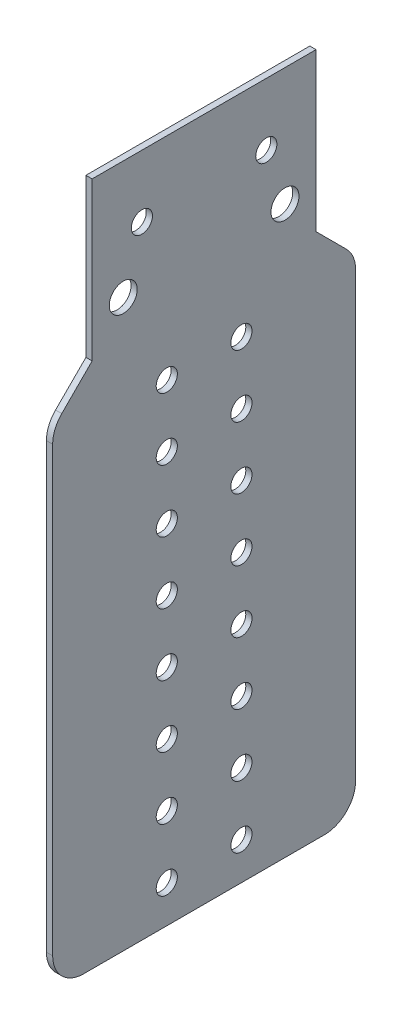
ISO-10303-21;
HEADER;
FILE_DESCRIPTION(('STEP AP214'),'2;1');
FILE_NAME('part.step','',(''),(''),'','','');
FILE_SCHEMA(('AUTOMOTIVE_DESIGN { 1 0 10303 214 1 1 1 1 }'));
ENDSEC;
DATA;
#1=APPLICATION_CONTEXT('core data for automotive mechanical design processes');
#2=APPLICATION_PROTOCOL_DEFINITION('international standard','automotive_design',2000,#1);
#3=PRODUCT_CONTEXT('',#1,'mechanical');
#4=PRODUCT('Part','Part','',(#3));
#5=PRODUCT_RELATED_PRODUCT_CATEGORY('part','',(#4));
#6=PRODUCT_DEFINITION_FORMATION('','',#4);
#7=PRODUCT_DEFINITION_CONTEXT('part definition',#1,'design');
#8=PRODUCT_DEFINITION('design','',#6,#7);
#9=PRODUCT_DEFINITION_SHAPE('','',#8);
#10=(LENGTH_UNIT() NAMED_UNIT(*) SI_UNIT(.MILLI.,.METRE.));
#11=(NAMED_UNIT(*) PLANE_ANGLE_UNIT() SI_UNIT($,.RADIAN.));
#12=(NAMED_UNIT(*) SI_UNIT($,.STERADIAN.) SOLID_ANGLE_UNIT());
#13=UNCERTAINTY_MEASURE_WITH_UNIT(LENGTH_MEASURE(1.E-05),#10,'distance_accuracy_value','');
#14=(GEOMETRIC_REPRESENTATION_CONTEXT(3) GLOBAL_UNCERTAINTY_ASSIGNED_CONTEXT((#13)) GLOBAL_UNIT_ASSIGNED_CONTEXT((#10,
#11,#12)) REPRESENTATION_CONTEXT('',''));
#15=CARTESIAN_POINT('',(0.,0.,0.));
#16=DIRECTION('',(0.,0.,1.));
#17=DIRECTION('',(1.,0.,0.));
#18=AXIS2_PLACEMENT_3D('',#15,#16,#17);
#19=CARTESIAN_POINT('',(1.,0.,-18.));
#20=DIRECTION('',(0.,0.,-1.));
#21=DIRECTION('',(0.,1.,0.));
#22=AXIS2_PLACEMENT_3D('',#19,#20,#21);
#23=PLANE('',#22);
#24=DIRECTION('',(0.,-1.,0.));
#25=VECTOR('',#24,1.);
#26=CARTESIAN_POINT('',(1.,0.,-18.));
#27=LINE('',#26,#25);
#28=CARTESIAN_POINT('',(1.,0.,-18.));
#29=VERTEX_POINT('',#28);
#30=CARTESIAN_POINT('',(1.,-25.35,-18.));
#31=VERTEX_POINT('',#30);
#32=EDGE_CURVE('E389',#29,#31,#27,.T.);
#33=ORIENTED_EDGE('',*,*,#32,.T.);
#34=DIRECTION('',(-1.,0.,0.));
#35=VECTOR('',#34,1.);
#36=CARTESIAN_POINT('',(85.8878377625441,-25.35,-18.));
#37=LINE('',#36,#35);
#38=CARTESIAN_POINT('',(0.,-25.35,-18.));
#39=VERTEX_POINT('',#38);
#40=EDGE_CURVE('E137',#31,#39,#37,.T.);
#41=ORIENTED_EDGE('',*,*,#40,.T.);
#42=DIRECTION('',(0.,-1.,0.));
#43=VECTOR('',#42,1.);
#44=CARTESIAN_POINT('',(0.,0.,-18.));
#45=LINE('',#44,#43);
#46=CARTESIAN_POINT('',(0.,0.,-18.));
#47=VERTEX_POINT('',#46);
#48=EDGE_CURVE('E153',#47,#39,#45,.T.);
#49=ORIENTED_EDGE('',*,*,#48,.F.);
#50=DIRECTION('',(-1.,0.,0.));
#51=VECTOR('',#50,1.);
#52=CARTESIAN_POINT('',(1.,0.,-18.));
#53=LINE('',#52,#51);
#54=EDGE_CURVE('E43',#29,#47,#53,.T.);
#55=ORIENTED_EDGE('',*,*,#54,.F.);
#56=EDGE_LOOP('',(#33,#41,#49,#55));
#57=FACE_BOUND('',#56,.T.);
#58=ADVANCED_FACE('F39',(#57),#23,.T.);
#59=CARTESIAN_POINT('',(1.,0.,18.));
#60=DIRECTION('',(0.,0.,-1.));
#61=DIRECTION('',(0.,1.,0.));
#62=AXIS2_PLACEMENT_3D('',#59,#60,#61);
#63=PLANE('',#62);
#64=DIRECTION('',(-1.,0.,0.));
#65=VECTOR('',#64,1.);
#66=CARTESIAN_POINT('',(85.8878377625441,-25.35,18.));
#67=LINE('',#66,#65);
#68=CARTESIAN_POINT('',(1.,-25.35,18.));
#69=VERTEX_POINT('',#68);
#70=CARTESIAN_POINT('',(0.,-25.35,18.));
#71=VERTEX_POINT('',#70);
#72=EDGE_CURVE('E63',#69,#71,#67,.T.);
#73=ORIENTED_EDGE('',*,*,#72,.F.);
#74=DIRECTION('',(0.,-1.,0.));
#75=VECTOR('',#74,1.);
#76=CARTESIAN_POINT('',(1.,0.,18.));
#77=LINE('',#76,#75);
#78=CARTESIAN_POINT('',(1.,0.,18.));
#79=VERTEX_POINT('',#78);
#80=EDGE_CURVE('E397',#79,#69,#77,.T.);
#81=ORIENTED_EDGE('',*,*,#80,.F.);
#82=DIRECTION('',(-1.,0.,0.));
#83=VECTOR('',#82,1.);
#84=CARTESIAN_POINT('',(1.,0.,18.));
#85=LINE('',#84,#83);
#86=CARTESIAN_POINT('',(0.,0.,18.));
#87=VERTEX_POINT('',#86);
#88=EDGE_CURVE('E11',#79,#87,#85,.T.);
#89=ORIENTED_EDGE('',*,*,#88,.T.);
#90=DIRECTION('',(0.,-1.,0.));
#91=VECTOR('',#90,1.);
#92=CARTESIAN_POINT('',(0.,0.,18.));
#93=LINE('',#92,#91);
#94=EDGE_CURVE('E390',#87,#71,#93,.T.);
#95=ORIENTED_EDGE('',*,*,#94,.T.);
#96=EDGE_LOOP('',(#73,#81,#89,#95));
#97=FACE_BOUND('',#96,.T.);
#98=ADVANCED_FACE('F409',(#97),#63,.F.);
#99=CARTESIAN_POINT('',(1.,0.,18.));
#100=DIRECTION('',(0.,1.,0.));
#101=DIRECTION('',(0.,0.,1.));
#102=AXIS2_PLACEMENT_3D('',#99,#100,#101);
#103=PLANE('',#102);
#104=DIRECTION('',(0.,0.,-1.));
#105=VECTOR('',#104,1.);
#106=CARTESIAN_POINT('',(0.,0.,18.));
#107=LINE('',#106,#105);
#108=EDGE_CURVE('E384',#87,#47,#107,.T.);
#109=ORIENTED_EDGE('',*,*,#108,.F.);
#110=ORIENTED_EDGE('',*,*,#88,.F.);
#111=DIRECTION('',(0.,0.,-1.));
#112=VECTOR('',#111,1.);
#113=CARTESIAN_POINT('',(1.,0.,18.));
#114=LINE('',#113,#112);
#115=EDGE_CURVE('E385',#79,#29,#114,.T.);
#116=ORIENTED_EDGE('',*,*,#115,.T.);
#117=ORIENTED_EDGE('',*,*,#54,.T.);
#118=EDGE_LOOP('',(#109,#110,#116,#117));
#119=FACE_BOUND('',#118,.T.);
#120=ADVANCED_FACE('F41',(#119),#103,.T.);
#121=CARTESIAN_POINT('',(1.,-110.,18.));
#122=DIRECTION('',(0.,1.,0.));
#123=DIRECTION('',(0.,0.,1.));
#124=AXIS2_PLACEMENT_3D('',#121,#122,#123);
#125=PLANE('',#124);
#126=DIRECTION('',(0.,0.,-1.));
#127=VECTOR('',#126,1.);
#128=CARTESIAN_POINT('',(0.,-110.,18.));
#129=LINE('',#128,#127);
#130=CARTESIAN_POINT('',(0.,-110.,19.35));
#131=VERTEX_POINT('',#130);
#132=CARTESIAN_POINT('',(0.,-110.,-19.35));
#133=VERTEX_POINT('',#132);
#134=EDGE_CURVE('E404',#131,#133,#129,.T.);
#135=ORIENTED_EDGE('',*,*,#134,.T.);
#136=DIRECTION('',(-1.,0.,0.));
#137=VECTOR('',#136,1.);
#138=CARTESIAN_POINT('',(85.8878377625441,-110.,-19.35));
#139=LINE('',#138,#137);
#140=CARTESIAN_POINT('',(1.,-110.,-19.35));
#141=VERTEX_POINT('',#140);
#142=EDGE_CURVE('E166',#141,#133,#139,.T.);
#143=ORIENTED_EDGE('',*,*,#142,.F.);
#144=DIRECTION('',(0.,0.,-1.));
#145=VECTOR('',#144,1.);
#146=CARTESIAN_POINT('',(1.,-110.,18.));
#147=LINE('',#146,#145);
#148=CARTESIAN_POINT('',(1.,-110.,19.35));
#149=VERTEX_POINT('',#148);
#150=EDGE_CURVE('E394',#149,#141,#147,.T.);
#151=ORIENTED_EDGE('',*,*,#150,.F.);
#152=DIRECTION('',(-1.,0.,0.));
#153=VECTOR('',#152,1.);
#154=CARTESIAN_POINT('',(85.8878377625441,-110.,19.35));
#155=LINE('',#154,#153);
#156=EDGE_CURVE('E210',#149,#131,#155,.T.);
#157=ORIENTED_EDGE('',*,*,#156,.T.);
#158=EDGE_LOOP('',(#135,#143,#151,#157));
#159=FACE_BOUND('',#158,.T.);
#160=ADVANCED_FACE('F444',(#159),#125,.F.);
#161=CARTESIAN_POINT('',(1.,0.,0.));
#162=DIRECTION('',(-1.,0.,0.));
#163=DIRECTION('',(0.,0.,1.));
#164=AXIS2_PLACEMENT_3D('',#161,#162,#163);
#165=PLANE('',#164);
#166=CARTESIAN_POINT('',(1.,-104.,-6.00000000000038));
#167=DIRECTION('',(1.,0.,0.));
#168=DIRECTION('',(0.,0.,-1.));
#169=AXIS2_PLACEMENT_3D('',#166,#167,#168);
#170=CIRCLE('',#169,1.69999999999999);
#171=CARTESIAN_POINT('',(1.,-104.,-7.70000000000037));
#172=VERTEX_POINT('',#171);
#173=EDGE_CURVE('E194',#172,#172,#170,.T.);
#174=ORIENTED_EDGE('',*,*,#173,.F.);
#175=EDGE_LOOP('',(#174));
#176=FACE_BOUND('',#175,.T.);
#177=CARTESIAN_POINT('',(1.,-104.,5.99999999999962));
#178=DIRECTION('',(1.,0.,0.));
#179=DIRECTION('',(0.,0.,-1.));
#180=AXIS2_PLACEMENT_3D('',#177,#178,#179);
#181=CIRCLE('',#180,1.69999999999999);
#182=CARTESIAN_POINT('',(1.,-104.,4.29999999999963));
#183=VERTEX_POINT('',#182);
#184=EDGE_CURVE('E232',#183,#183,#181,.T.);
#185=ORIENTED_EDGE('',*,*,#184,.F.);
#186=EDGE_LOOP('',(#185));
#187=FACE_BOUND('',#186,.T.);
#188=CARTESIAN_POINT('',(1.,-94.,-6.00000000000034));
#189=DIRECTION('',(1.,0.,0.));
#190=DIRECTION('',(0.,0.,-1.));
#191=AXIS2_PLACEMENT_3D('',#188,#189,#190);
#192=CIRCLE('',#191,1.69999999999999);
#193=CARTESIAN_POINT('',(1.,-94.,-7.70000000000033));
#194=VERTEX_POINT('',#193);
#195=EDGE_CURVE('E240',#194,#194,#192,.T.);
#196=ORIENTED_EDGE('',*,*,#195,.F.);
#197=EDGE_LOOP('',(#196));
#198=FACE_BOUND('',#197,.T.);
#199=CARTESIAN_POINT('',(1.,-94.,5.99999999999966));
#200=DIRECTION('',(1.,0.,0.));
#201=DIRECTION('',(0.,0.,-1.));
#202=AXIS2_PLACEMENT_3D('',#199,#200,#201);
#203=CIRCLE('',#202,1.69999999999999);
#204=CARTESIAN_POINT('',(1.,-94.,4.29999999999967));
#205=VERTEX_POINT('',#204);
#206=EDGE_CURVE('E248',#205,#205,#203,.T.);
#207=ORIENTED_EDGE('',*,*,#206,.F.);
#208=EDGE_LOOP('',(#207));
#209=FACE_BOUND('',#208,.T.);
#210=CARTESIAN_POINT('',(1.,-84.,-6.00000000000031));
#211=DIRECTION('',(1.,0.,0.));
#212=DIRECTION('',(0.,0.,-1.));
#213=AXIS2_PLACEMENT_3D('',#210,#211,#212);
#214=CIRCLE('',#213,1.69999999999999);
#215=CARTESIAN_POINT('',(1.,-84.,-7.7000000000003));
#216=VERTEX_POINT('',#215);
#217=EDGE_CURVE('E256',#216,#216,#214,.T.);
#218=ORIENTED_EDGE('',*,*,#217,.F.);
#219=EDGE_LOOP('',(#218));
#220=FACE_BOUND('',#219,.T.);
#221=CARTESIAN_POINT('',(1.,-84.,5.99999999999969));
#222=DIRECTION('',(1.,0.,0.));
#223=DIRECTION('',(0.,0.,-1.));
#224=AXIS2_PLACEMENT_3D('',#221,#222,#223);
#225=CIRCLE('',#224,1.69999999999999);
#226=CARTESIAN_POINT('',(1.,-84.,4.2999999999997));
#227=VERTEX_POINT('',#226);
#228=EDGE_CURVE('E264',#227,#227,#225,.T.);
#229=ORIENTED_EDGE('',*,*,#228,.F.);
#230=EDGE_LOOP('',(#229));
#231=FACE_BOUND('',#230,.T.);
#232=CARTESIAN_POINT('',(1.,-74.,-6.00000000000027));
#233=DIRECTION('',(1.,0.,0.));
#234=DIRECTION('',(0.,0.,-1.));
#235=AXIS2_PLACEMENT_3D('',#232,#233,#234);
#236=CIRCLE('',#235,1.69999999999999);
#237=CARTESIAN_POINT('',(1.,-74.,-7.70000000000026));
#238=VERTEX_POINT('',#237);
#239=EDGE_CURVE('E272',#238,#238,#236,.T.);
#240=ORIENTED_EDGE('',*,*,#239,.F.);
#241=EDGE_LOOP('',(#240));
#242=FACE_BOUND('',#241,.T.);
#243=CARTESIAN_POINT('',(1.,-74.,5.99999999999973));
#244=DIRECTION('',(1.,0.,0.));
#245=DIRECTION('',(0.,0.,-1.));
#246=AXIS2_PLACEMENT_3D('',#243,#244,#245);
#247=CIRCLE('',#246,1.69999999999999);
#248=CARTESIAN_POINT('',(1.,-74.,4.29999999999974));
#249=VERTEX_POINT('',#248);
#250=EDGE_CURVE('E280',#249,#249,#247,.T.);
#251=ORIENTED_EDGE('',*,*,#250,.F.);
#252=EDGE_LOOP('',(#251));
#253=FACE_BOUND('',#252,.T.);
#254=CARTESIAN_POINT('',(1.,-64.,-6.00000000000024));
#255=DIRECTION('',(1.,0.,0.));
#256=DIRECTION('',(0.,0.,-1.));
#257=AXIS2_PLACEMENT_3D('',#254,#255,#256);
#258=CIRCLE('',#257,1.69999999999999);
#259=CARTESIAN_POINT('',(1.,-64.,-7.70000000000022));
#260=VERTEX_POINT('',#259);
#261=EDGE_CURVE('E288',#260,#260,#258,.T.);
#262=ORIENTED_EDGE('',*,*,#261,.F.);
#263=EDGE_LOOP('',(#262));
#264=FACE_BOUND('',#263,.T.);
#265=CARTESIAN_POINT('',(1.,-64.,5.99999999999976));
#266=DIRECTION('',(1.,0.,0.));
#267=DIRECTION('',(0.,0.,-1.));
#268=AXIS2_PLACEMENT_3D('',#265,#266,#267);
#269=CIRCLE('',#268,1.69999999999999);
#270=CARTESIAN_POINT('',(1.,-64.,4.29999999999978));
#271=VERTEX_POINT('',#270);
#272=EDGE_CURVE('E296',#271,#271,#269,.T.);
#273=ORIENTED_EDGE('',*,*,#272,.F.);
#274=EDGE_LOOP('',(#273));
#275=FACE_BOUND('',#274,.T.);
#276=CARTESIAN_POINT('',(1.,-54.,-6.0000000000002));
#277=DIRECTION('',(1.,0.,0.));
#278=DIRECTION('',(0.,0.,-1.));
#279=AXIS2_PLACEMENT_3D('',#276,#277,#278);
#280=CIRCLE('',#279,1.69999999999999);
#281=CARTESIAN_POINT('',(1.,-54.,-7.70000000000019));
#282=VERTEX_POINT('',#281);
#283=EDGE_CURVE('E304',#282,#282,#280,.T.);
#284=ORIENTED_EDGE('',*,*,#283,.F.);
#285=EDGE_LOOP('',(#284));
#286=FACE_BOUND('',#285,.T.);
#287=CARTESIAN_POINT('',(1.,-54.,5.9999999999998));
#288=DIRECTION('',(1.,0.,0.));
#289=DIRECTION('',(0.,0.,-1.));
#290=AXIS2_PLACEMENT_3D('',#287,#288,#289);
#291=CIRCLE('',#290,1.69999999999999);
#292=CARTESIAN_POINT('',(1.,-54.,4.29999999999981));
#293=VERTEX_POINT('',#292);
#294=EDGE_CURVE('E312',#293,#293,#291,.T.);
#295=ORIENTED_EDGE('',*,*,#294,.F.);
#296=EDGE_LOOP('',(#295));
#297=FACE_BOUND('',#296,.T.);
#298=CARTESIAN_POINT('',(1.,-44.,-6.00000000000017));
#299=DIRECTION('',(1.,0.,0.));
#300=DIRECTION('',(0.,0.,-1.));
#301=AXIS2_PLACEMENT_3D('',#298,#299,#300);
#302=CIRCLE('',#301,1.69999999999999);
#303=CARTESIAN_POINT('',(1.,-44.,-7.70000000000015));
#304=VERTEX_POINT('',#303);
#305=EDGE_CURVE('E320',#304,#304,#302,.T.);
#306=ORIENTED_EDGE('',*,*,#305,.F.);
#307=EDGE_LOOP('',(#306));
#308=FACE_BOUND('',#307,.T.);
#309=CARTESIAN_POINT('',(1.,-44.,5.99999999999983));
#310=DIRECTION('',(1.,0.,0.));
#311=DIRECTION('',(0.,0.,-1.));
#312=AXIS2_PLACEMENT_3D('',#309,#310,#311);
#313=CIRCLE('',#312,1.69999999999999);
#314=CARTESIAN_POINT('',(1.,-44.,4.29999999999985));
#315=VERTEX_POINT('',#314);
#316=EDGE_CURVE('E328',#315,#315,#313,.T.);
#317=ORIENTED_EDGE('',*,*,#316,.F.);
#318=EDGE_LOOP('',(#317));
#319=FACE_BOUND('',#318,.T.);
#320=CARTESIAN_POINT('',(1.,-34.,-6.00000000000013));
#321=DIRECTION('',(1.,0.,0.));
#322=DIRECTION('',(0.,0.,-1.));
#323=AXIS2_PLACEMENT_3D('',#320,#321,#322);
#324=CIRCLE('',#323,1.69999999999999);
#325=CARTESIAN_POINT('',(1.,-34.,-7.70000000000012));
#326=VERTEX_POINT('',#325);
#327=EDGE_CURVE('E336',#326,#326,#324,.T.);
#328=ORIENTED_EDGE('',*,*,#327,.F.);
#329=EDGE_LOOP('',(#328));
#330=FACE_BOUND('',#329,.T.);
#331=CARTESIAN_POINT('',(1.,-34.,5.99999999999987));
#332=DIRECTION('',(1.,0.,0.));
#333=DIRECTION('',(0.,0.,-1.));
#334=AXIS2_PLACEMENT_3D('',#331,#332,#333);
#335=CIRCLE('',#334,1.69999999999999);
#336=CARTESIAN_POINT('',(1.,-34.,4.29999999999988));
#337=VERTEX_POINT('',#336);
#338=EDGE_CURVE('E344',#337,#337,#335,.T.);
#339=ORIENTED_EDGE('',*,*,#338,.F.);
#340=EDGE_LOOP('',(#339));
#341=FACE_BOUND('',#340,.T.);
#342=CARTESIAN_POINT('',(1.,-19.,-13.));
#343=DIRECTION('',(-1.,0.,0.));
#344=DIRECTION('',(0.,0.,1.));
#345=AXIS2_PLACEMENT_3D('',#342,#343,#344);
#346=CIRCLE('',#345,2.25);
#347=CARTESIAN_POINT('',(1.,-19.,-10.75));
#348=VERTEX_POINT('',#347);
#349=EDGE_CURVE('E356',#348,#348,#346,.T.);
#350=ORIENTED_EDGE('',*,*,#349,.T.);
#351=EDGE_LOOP('',(#350));
#352=FACE_BOUND('',#351,.T.);
#353=CARTESIAN_POINT('',(1.,-19.,13.));
#354=DIRECTION('',(-1.,0.,0.));
#355=DIRECTION('',(0.,0.,1.));
#356=AXIS2_PLACEMENT_3D('',#353,#354,#355);
#357=CIRCLE('',#356,2.25);
#358=CARTESIAN_POINT('',(1.,-19.,15.25));
#359=VERTEX_POINT('',#358);
#360=EDGE_CURVE('E364',#359,#359,#357,.T.);
#361=ORIENTED_EDGE('',*,*,#360,.T.);
#362=EDGE_LOOP('',(#361));
#363=FACE_BOUND('',#362,.T.);
#364=CARTESIAN_POINT('',(1.,-10.,-9.99999999999999));
#365=DIRECTION('',(-1.,0.,0.));
#366=DIRECTION('',(0.,0.,1.));
#367=AXIS2_PLACEMENT_3D('',#364,#365,#366);
#368=CIRCLE('',#367,1.7);
#369=CARTESIAN_POINT('',(1.,-10.,-8.3));
#370=VERTEX_POINT('',#369);
#371=EDGE_CURVE('E372',#370,#370,#368,.T.);
#372=ORIENTED_EDGE('',*,*,#371,.T.);
#373=EDGE_LOOP('',(#372));
#374=FACE_BOUND('',#373,.T.);
#375=CARTESIAN_POINT('',(1.,-10.,10.));
#376=DIRECTION('',(-1.,0.,0.));
#377=DIRECTION('',(0.,0.,1.));
#378=AXIS2_PLACEMENT_3D('',#375,#376,#377);
#379=CIRCLE('',#378,1.7);
#380=CARTESIAN_POINT('',(1.,-10.,11.7));
#381=VERTEX_POINT('',#380);
#382=EDGE_CURVE('E380',#381,#381,#379,.T.);
#383=ORIENTED_EDGE('',*,*,#382,.T.);
#384=EDGE_LOOP('',(#383));
#385=FACE_BOUND('',#384,.T.);
#386=ORIENTED_EDGE('',*,*,#115,.F.);
#387=ORIENTED_EDGE('',*,*,#80,.T.);
#388=DIRECTION('',(0.,-0.707106781186551,0.707106781186544));
#389=VECTOR('',#388,1.);
#390=CARTESIAN_POINT('',(1.,-25.35,18.));
#391=LINE('',#390,#389);
#392=CARTESIAN_POINT('',(1.,-30.2355339059328,22.8855339059328));
#393=VERTEX_POINT('',#392);
#394=EDGE_CURVE('E191',#69,#393,#391,.T.);
#395=ORIENTED_EDGE('',*,*,#394,.T.);
#396=CARTESIAN_POINT('',(1.,-33.7710678118655,19.35));
#397=DIRECTION('',(-1.,0.,0.));
#398=DIRECTION('',(0.,0.,1.));
#399=AXIS2_PLACEMENT_3D('',#396,#397,#398);
#400=CIRCLE('',#399,5.);
#401=CARTESIAN_POINT('',(1.,-33.7710678118655,24.35));
#402=VERTEX_POINT('',#401);
#403=EDGE_CURVE('E188',#393,#402,#400,.F.);
#404=ORIENTED_EDGE('',*,*,#403,.T.);
#405=DIRECTION('',(0.,-1.,0.));
#406=VECTOR('',#405,1.);
#407=CARTESIAN_POINT('',(1.,-33.7710678118655,24.35));
#408=LINE('',#407,#406);
#409=CARTESIAN_POINT('',(1.,-105.,24.35));
#410=VERTEX_POINT('',#409);
#411=EDGE_CURVE('E185',#402,#410,#408,.T.);
#412=ORIENTED_EDGE('',*,*,#411,.T.);
#413=CARTESIAN_POINT('',(1.,-105.,19.35));
#414=DIRECTION('',(-1.,0.,0.));
#415=DIRECTION('',(0.,0.,1.));
#416=AXIS2_PLACEMENT_3D('',#413,#414,#415);
#417=CIRCLE('',#416,5.);
#418=EDGE_CURVE('E181',#410,#149,#417,.F.);
#419=ORIENTED_EDGE('',*,*,#418,.T.);
#420=ORIENTED_EDGE('',*,*,#150,.T.);
#421=CARTESIAN_POINT('',(1.,-105.,-19.35));
#422=DIRECTION('',(-1.,0.,0.));
#423=DIRECTION('',(0.,0.,1.));
#424=AXIS2_PLACEMENT_3D('',#421,#422,#423);
#425=CIRCLE('',#424,5.);
#426=CARTESIAN_POINT('',(1.,-105.,-24.35));
#427=VERTEX_POINT('',#426);
#428=EDGE_CURVE('E157',#141,#427,#425,.F.);
#429=ORIENTED_EDGE('',*,*,#428,.T.);
#430=DIRECTION('',(0.,1.,0.));
#431=VECTOR('',#430,1.);
#432=CARTESIAN_POINT('',(1.,-33.7710678118655,-24.35));
#433=LINE('',#432,#431);
#434=CARTESIAN_POINT('',(1.,-33.7710678118655,-24.35));
#435=VERTEX_POINT('',#434);
#436=EDGE_CURVE('E443',#427,#435,#433,.T.);
#437=ORIENTED_EDGE('',*,*,#436,.T.);
#438=CARTESIAN_POINT('',(1.,-33.7710678118655,-19.35));
#439=DIRECTION('',(-1.,0.,0.));
#440=DIRECTION('',(0.,0.,1.));
#441=AXIS2_PLACEMENT_3D('',#438,#439,#440);
#442=CIRCLE('',#441,5.);
#443=CARTESIAN_POINT('',(1.,-30.2355339059328,-22.8855339059328));
#444=VERTEX_POINT('',#443);
#445=EDGE_CURVE('E170',#435,#444,#442,.F.);
#446=ORIENTED_EDGE('',*,*,#445,.T.);
#447=DIRECTION('',(0.,0.707106781186551,0.707106781186544));
#448=VECTOR('',#447,1.);
#449=CARTESIAN_POINT('',(1.,-25.35,-18.));
#450=LINE('',#449,#448);
#451=EDGE_CURVE('E132',#444,#31,#450,.T.);
#452=ORIENTED_EDGE('',*,*,#451,.T.);
#453=ORIENTED_EDGE('',*,*,#32,.F.);
#454=EDGE_LOOP('',(#386,#387,#395,#404,#412,#419,#420,#429,#437,#446,#452,#453));
#455=FACE_BOUND('',#454,.T.);
#456=ADVANCED_FACE('F425',(#176,#187,#198,#209,#220,#231,#242,#253,#264,#275,#286,#297,#308,
#319,#330,#341,#352,#363,#374,#385,#455),#165,.F.);
#457=CARTESIAN_POINT('',(0.,0.,0.));
#458=DIRECTION('',(-1.,0.,0.));
#459=DIRECTION('',(0.,0.,1.));
#460=AXIS2_PLACEMENT_3D('',#457,#458,#459);
#461=PLANE('',#460);
#462=CARTESIAN_POINT('',(0.,-104.,-6.00000000000038));
#463=DIRECTION('',(1.,0.,0.));
#464=DIRECTION('',(0.,0.,-1.));
#465=AXIS2_PLACEMENT_3D('',#462,#463,#464);
#466=CIRCLE('',#465,1.69999999999999);
#467=CARTESIAN_POINT('',(0.,-104.,-7.70000000000037));
#468=VERTEX_POINT('',#467);
#469=EDGE_CURVE('E228',#468,#468,#466,.T.);
#470=ORIENTED_EDGE('',*,*,#469,.T.);
#471=EDGE_LOOP('',(#470));
#472=FACE_BOUND('',#471,.T.);
#473=CARTESIAN_POINT('',(0.,-104.,5.99999999999962));
#474=DIRECTION('',(1.,0.,0.));
#475=DIRECTION('',(0.,0.,-1.));
#476=AXIS2_PLACEMENT_3D('',#473,#474,#475);
#477=CIRCLE('',#476,1.69999999999999);
#478=CARTESIAN_POINT('',(0.,-104.,4.29999999999963));
#479=VERTEX_POINT('',#478);
#480=EDGE_CURVE('E236',#479,#479,#477,.T.);
#481=ORIENTED_EDGE('',*,*,#480,.T.);
#482=EDGE_LOOP('',(#481));
#483=FACE_BOUND('',#482,.T.);
#484=CARTESIAN_POINT('',(0.,-94.,-6.00000000000034));
#485=DIRECTION('',(1.,0.,0.));
#486=DIRECTION('',(0.,0.,-1.));
#487=AXIS2_PLACEMENT_3D('',#484,#485,#486);
#488=CIRCLE('',#487,1.69999999999999);
#489=CARTESIAN_POINT('',(0.,-94.,-7.70000000000033));
#490=VERTEX_POINT('',#489);
#491=EDGE_CURVE('E244',#490,#490,#488,.T.);
#492=ORIENTED_EDGE('',*,*,#491,.T.);
#493=EDGE_LOOP('',(#492));
#494=FACE_BOUND('',#493,.T.);
#495=CARTESIAN_POINT('',(0.,-94.,5.99999999999966));
#496=DIRECTION('',(1.,0.,0.));
#497=DIRECTION('',(0.,0.,-1.));
#498=AXIS2_PLACEMENT_3D('',#495,#496,#497);
#499=CIRCLE('',#498,1.69999999999999);
#500=CARTESIAN_POINT('',(0.,-94.,4.29999999999967));
#501=VERTEX_POINT('',#500);
#502=EDGE_CURVE('E252',#501,#501,#499,.T.);
#503=ORIENTED_EDGE('',*,*,#502,.T.);
#504=EDGE_LOOP('',(#503));
#505=FACE_BOUND('',#504,.T.);
#506=CARTESIAN_POINT('',(0.,-84.,-6.00000000000031));
#507=DIRECTION('',(1.,0.,0.));
#508=DIRECTION('',(0.,0.,-1.));
#509=AXIS2_PLACEMENT_3D('',#506,#507,#508);
#510=CIRCLE('',#509,1.69999999999999);
#511=CARTESIAN_POINT('',(0.,-84.,-7.7000000000003));
#512=VERTEX_POINT('',#511);
#513=EDGE_CURVE('E260',#512,#512,#510,.T.);
#514=ORIENTED_EDGE('',*,*,#513,.T.);
#515=EDGE_LOOP('',(#514));
#516=FACE_BOUND('',#515,.T.);
#517=CARTESIAN_POINT('',(0.,-84.,5.99999999999969));
#518=DIRECTION('',(1.,0.,0.));
#519=DIRECTION('',(0.,0.,-1.));
#520=AXIS2_PLACEMENT_3D('',#517,#518,#519);
#521=CIRCLE('',#520,1.69999999999999);
#522=CARTESIAN_POINT('',(0.,-84.,4.2999999999997));
#523=VERTEX_POINT('',#522);
#524=EDGE_CURVE('E268',#523,#523,#521,.T.);
#525=ORIENTED_EDGE('',*,*,#524,.T.);
#526=EDGE_LOOP('',(#525));
#527=FACE_BOUND('',#526,.T.);
#528=CARTESIAN_POINT('',(0.,-74.,-6.00000000000027));
#529=DIRECTION('',(1.,0.,0.));
#530=DIRECTION('',(0.,0.,-1.));
#531=AXIS2_PLACEMENT_3D('',#528,#529,#530);
#532=CIRCLE('',#531,1.69999999999999);
#533=CARTESIAN_POINT('',(0.,-74.,-7.70000000000026));
#534=VERTEX_POINT('',#533);
#535=EDGE_CURVE('E276',#534,#534,#532,.T.);
#536=ORIENTED_EDGE('',*,*,#535,.T.);
#537=EDGE_LOOP('',(#536));
#538=FACE_BOUND('',#537,.T.);
#539=CARTESIAN_POINT('',(0.,-74.,5.99999999999973));
#540=DIRECTION('',(1.,0.,0.));
#541=DIRECTION('',(0.,0.,-1.));
#542=AXIS2_PLACEMENT_3D('',#539,#540,#541);
#543=CIRCLE('',#542,1.69999999999999);
#544=CARTESIAN_POINT('',(0.,-74.,4.29999999999974));
#545=VERTEX_POINT('',#544);
#546=EDGE_CURVE('E284',#545,#545,#543,.T.);
#547=ORIENTED_EDGE('',*,*,#546,.T.);
#548=EDGE_LOOP('',(#547));
#549=FACE_BOUND('',#548,.T.);
#550=CARTESIAN_POINT('',(0.,-64.,-6.00000000000024));
#551=DIRECTION('',(1.,0.,0.));
#552=DIRECTION('',(0.,0.,-1.));
#553=AXIS2_PLACEMENT_3D('',#550,#551,#552);
#554=CIRCLE('',#553,1.7);
#555=CARTESIAN_POINT('',(0.,-64.,-7.70000000000024));
#556=VERTEX_POINT('',#555);
#557=EDGE_CURVE('E292',#556,#556,#554,.T.);
#558=ORIENTED_EDGE('',*,*,#557,.T.);
#559=EDGE_LOOP('',(#558));
#560=FACE_BOUND('',#559,.T.);
#561=CARTESIAN_POINT('',(0.,-64.,5.99999999999976));
#562=DIRECTION('',(1.,0.,0.));
#563=DIRECTION('',(0.,0.,-1.));
#564=AXIS2_PLACEMENT_3D('',#561,#562,#563);
#565=CIRCLE('',#564,1.7);
#566=CARTESIAN_POINT('',(0.,-64.,4.29999999999976));
#567=VERTEX_POINT('',#566);
#568=EDGE_CURVE('E300',#567,#567,#565,.T.);
#569=ORIENTED_EDGE('',*,*,#568,.T.);
#570=EDGE_LOOP('',(#569));
#571=FACE_BOUND('',#570,.T.);
#572=CARTESIAN_POINT('',(0.,-54.,-6.0000000000002));
#573=DIRECTION('',(1.,0.,0.));
#574=DIRECTION('',(0.,0.,-1.));
#575=AXIS2_PLACEMENT_3D('',#572,#573,#574);
#576=CIRCLE('',#575,1.7);
#577=CARTESIAN_POINT('',(0.,-54.,-7.7000000000002));
#578=VERTEX_POINT('',#577);
#579=EDGE_CURVE('E308',#578,#578,#576,.T.);
#580=ORIENTED_EDGE('',*,*,#579,.T.);
#581=EDGE_LOOP('',(#580));
#582=FACE_BOUND('',#581,.T.);
#583=CARTESIAN_POINT('',(0.,-54.,5.9999999999998));
#584=DIRECTION('',(1.,0.,0.));
#585=DIRECTION('',(0.,0.,-1.));
#586=AXIS2_PLACEMENT_3D('',#583,#584,#585);
#587=CIRCLE('',#586,1.7);
#588=CARTESIAN_POINT('',(0.,-54.,4.2999999999998));
#589=VERTEX_POINT('',#588);
#590=EDGE_CURVE('E316',#589,#589,#587,.T.);
#591=ORIENTED_EDGE('',*,*,#590,.T.);
#592=EDGE_LOOP('',(#591));
#593=FACE_BOUND('',#592,.T.);
#594=CARTESIAN_POINT('',(0.,-44.,-6.00000000000017));
#595=DIRECTION('',(1.,0.,0.));
#596=DIRECTION('',(0.,0.,-1.));
#597=AXIS2_PLACEMENT_3D('',#594,#595,#596);
#598=CIRCLE('',#597,1.7);
#599=CARTESIAN_POINT('',(0.,-44.,-7.70000000000017));
#600=VERTEX_POINT('',#599);
#601=EDGE_CURVE('E324',#600,#600,#598,.T.);
#602=ORIENTED_EDGE('',*,*,#601,.T.);
#603=EDGE_LOOP('',(#602));
#604=FACE_BOUND('',#603,.T.);
#605=CARTESIAN_POINT('',(0.,-44.,5.99999999999983));
#606=DIRECTION('',(1.,0.,0.));
#607=DIRECTION('',(0.,0.,-1.));
#608=AXIS2_PLACEMENT_3D('',#605,#606,#607);
#609=CIRCLE('',#608,1.7);
#610=CARTESIAN_POINT('',(0.,-44.,4.29999999999983));
#611=VERTEX_POINT('',#610);
#612=EDGE_CURVE('E332',#611,#611,#609,.T.);
#613=ORIENTED_EDGE('',*,*,#612,.T.);
#614=EDGE_LOOP('',(#613));
#615=FACE_BOUND('',#614,.T.);
#616=CARTESIAN_POINT('',(0.,-34.,-6.00000000000013));
#617=DIRECTION('',(1.,0.,0.));
#618=DIRECTION('',(0.,0.,-1.));
#619=AXIS2_PLACEMENT_3D('',#616,#617,#618);
#620=CIRCLE('',#619,1.7);
#621=CARTESIAN_POINT('',(0.,-34.,-7.70000000000013));
#622=VERTEX_POINT('',#621);
#623=EDGE_CURVE('E340',#622,#622,#620,.T.);
#624=ORIENTED_EDGE('',*,*,#623,.T.);
#625=EDGE_LOOP('',(#624));
#626=FACE_BOUND('',#625,.T.);
#627=CARTESIAN_POINT('',(0.,-34.,5.99999999999987));
#628=DIRECTION('',(1.,0.,0.));
#629=DIRECTION('',(0.,0.,-1.));
#630=AXIS2_PLACEMENT_3D('',#627,#628,#629);
#631=CIRCLE('',#630,1.7);
#632=CARTESIAN_POINT('',(0.,-34.,4.29999999999987));
#633=VERTEX_POINT('',#632);
#634=EDGE_CURVE('E348',#633,#633,#631,.T.);
#635=ORIENTED_EDGE('',*,*,#634,.T.);
#636=EDGE_LOOP('',(#635));
#637=FACE_BOUND('',#636,.T.);
#638=CARTESIAN_POINT('',(0.,-19.,-13.));
#639=DIRECTION('',(-1.,0.,0.));
#640=DIRECTION('',(0.,0.,1.));
#641=AXIS2_PLACEMENT_3D('',#638,#639,#640);
#642=CIRCLE('',#641,2.25);
#643=CARTESIAN_POINT('',(0.,-19.,-10.75));
#644=VERTEX_POINT('',#643);
#645=EDGE_CURVE('E352',#644,#644,#642,.T.);
#646=ORIENTED_EDGE('',*,*,#645,.F.);
#647=EDGE_LOOP('',(#646));
#648=FACE_BOUND('',#647,.T.);
#649=CARTESIAN_POINT('',(0.,-19.,13.));
#650=DIRECTION('',(-1.,0.,0.));
#651=DIRECTION('',(0.,0.,1.));
#652=AXIS2_PLACEMENT_3D('',#649,#650,#651);
#653=CIRCLE('',#652,2.25);
#654=CARTESIAN_POINT('',(0.,-19.,15.25));
#655=VERTEX_POINT('',#654);
#656=EDGE_CURVE('E360',#655,#655,#653,.T.);
#657=ORIENTED_EDGE('',*,*,#656,.F.);
#658=EDGE_LOOP('',(#657));
#659=FACE_BOUND('',#658,.T.);
#660=CARTESIAN_POINT('',(0.,-10.,-9.99999999999999));
#661=DIRECTION('',(-1.,0.,0.));
#662=DIRECTION('',(0.,0.,1.));
#663=AXIS2_PLACEMENT_3D('',#660,#661,#662);
#664=CIRCLE('',#663,1.69999999999999);
#665=CARTESIAN_POINT('',(0.,-10.,-8.30000000000001));
#666=VERTEX_POINT('',#665);
#667=EDGE_CURVE('E368',#666,#666,#664,.T.);
#668=ORIENTED_EDGE('',*,*,#667,.F.);
#669=EDGE_LOOP('',(#668));
#670=FACE_BOUND('',#669,.T.);
#671=CARTESIAN_POINT('',(0.,-10.,10.));
#672=DIRECTION('',(-1.,0.,0.));
#673=DIRECTION('',(0.,0.,1.));
#674=AXIS2_PLACEMENT_3D('',#671,#672,#673);
#675=CIRCLE('',#674,1.69999999999999);
#676=CARTESIAN_POINT('',(0.,-10.,11.7));
#677=VERTEX_POINT('',#676);
#678=EDGE_CURVE('E376',#677,#677,#675,.T.);
#679=ORIENTED_EDGE('',*,*,#678,.F.);
#680=EDGE_LOOP('',(#679));
#681=FACE_BOUND('',#680,.T.);
#682=ORIENTED_EDGE('',*,*,#108,.T.);
#683=ORIENTED_EDGE('',*,*,#48,.T.);
#684=DIRECTION('',(0.,-0.707106781186551,-0.707106781186544));
#685=VECTOR('',#684,1.);
#686=CARTESIAN_POINT('',(0.,-25.35,-18.));
#687=LINE('',#686,#685);
#688=CARTESIAN_POINT('',(0.,-30.2355339059328,-22.8855339059328));
#689=VERTEX_POINT('',#688);
#690=EDGE_CURVE('E55',#39,#689,#687,.T.);
#691=ORIENTED_EDGE('',*,*,#690,.T.);
#692=CARTESIAN_POINT('',(0.,-33.7710678118655,-19.35));
#693=DIRECTION('',(-1.,0.,0.));
#694=DIRECTION('',(0.,0.,1.));
#695=AXIS2_PLACEMENT_3D('',#692,#693,#694);
#696=CIRCLE('',#695,5.);
#697=CARTESIAN_POINT('',(0.,-33.7710678118655,-24.35));
#698=VERTEX_POINT('',#697);
#699=EDGE_CURVE('E140',#689,#698,#696,.T.);
#700=ORIENTED_EDGE('',*,*,#699,.T.);
#701=DIRECTION('',(0.,-1.,0.));
#702=VECTOR('',#701,1.);
#703=CARTESIAN_POINT('',(0.,-33.7710678118655,-24.35));
#704=LINE('',#703,#702);
#705=CARTESIAN_POINT('',(0.,-105.,-24.35));
#706=VERTEX_POINT('',#705);
#707=EDGE_CURVE('E147',#698,#706,#704,.T.);
#708=ORIENTED_EDGE('',*,*,#707,.T.);
#709=CARTESIAN_POINT('',(0.,-105.,-19.35));
#710=DIRECTION('',(-1.,0.,0.));
#711=DIRECTION('',(0.,0.,1.));
#712=AXIS2_PLACEMENT_3D('',#709,#710,#711);
#713=CIRCLE('',#712,5.);
#714=EDGE_CURVE('E162',#706,#133,#713,.T.);
#715=ORIENTED_EDGE('',*,*,#714,.T.);
#716=ORIENTED_EDGE('',*,*,#134,.F.);
#717=CARTESIAN_POINT('',(0.,-105.,19.35));
#718=DIRECTION('',(-1.,0.,0.));
#719=DIRECTION('',(0.,0.,-1.));
#720=AXIS2_PLACEMENT_3D('',#717,#718,#719);
#721=CIRCLE('',#720,5.);
#722=CARTESIAN_POINT('',(0.,-105.,24.35));
#723=VERTEX_POINT('',#722);
#724=EDGE_CURVE('E180',#131,#723,#721,.T.);
#725=ORIENTED_EDGE('',*,*,#724,.T.);
#726=DIRECTION('',(0.,1.,0.));
#727=VECTOR('',#726,1.);
#728=CARTESIAN_POINT('',(0.,-33.7710678118655,24.35));
#729=LINE('',#728,#727);
#730=CARTESIAN_POINT('',(0.,-33.7710678118655,24.35));
#731=VERTEX_POINT('',#730);
#732=EDGE_CURVE('E198',#723,#731,#729,.T.);
#733=ORIENTED_EDGE('',*,*,#732,.T.);
#734=CARTESIAN_POINT('',(0.,-33.7710678118655,19.35));
#735=DIRECTION('',(-1.,0.,0.));
#736=DIRECTION('',(0.,0.,-1.));
#737=AXIS2_PLACEMENT_3D('',#734,#735,#736);
#738=CIRCLE('',#737,5.);
#739=CARTESIAN_POINT('',(0.,-30.2355339059328,22.8855339059328));
#740=VERTEX_POINT('',#739);
#741=EDGE_CURVE('E202',#731,#740,#738,.T.);
#742=ORIENTED_EDGE('',*,*,#741,.T.);
#743=DIRECTION('',(0.,0.707106781186551,-0.707106781186544));
#744=VECTOR('',#743,1.);
#745=CARTESIAN_POINT('',(0.,-25.35,18.));
#746=LINE('',#745,#744);
#747=EDGE_CURVE('E206',#740,#71,#746,.T.);
#748=ORIENTED_EDGE('',*,*,#747,.T.);
#749=ORIENTED_EDGE('',*,*,#94,.F.);
#750=EDGE_LOOP('',(#682,#683,#691,#700,#708,#715,#716,#725,#733,#742,#748,#749));
#751=FACE_BOUND('',#750,.T.);
#752=ADVANCED_FACE('F151',(#472,#483,#494,#505,#516,#527,#538,#549,#560,#571,#582,#593,#604,
#615,#626,#637,#648,#659,#670,#681,#751),#461,.T.);
#753=CARTESIAN_POINT('',(0.,-10.,10.));
#754=DIRECTION('',(-1.,0.,0.));
#755=DIRECTION('',(0.,0.,1.));
#756=AXIS2_PLACEMENT_3D('',#753,#754,#755);
#757=CYLINDRICAL_SURFACE('',#756,1.69999999999999);
#758=ORIENTED_EDGE('',*,*,#382,.F.);
#759=EDGE_LOOP('',(#758));
#760=FACE_BOUND('',#759,.T.);
#761=ORIENTED_EDGE('',*,*,#678,.T.);
#762=EDGE_LOOP('',(#761));
#763=FACE_BOUND('',#762,.T.);
#764=ADVANCED_FACE('F469',(#760,#763),#757,.F.);
#765=CARTESIAN_POINT('',(0.,-10.,-9.99999999999999));
#766=DIRECTION('',(-1.,0.,0.));
#767=DIRECTION('',(0.,0.,1.));
#768=AXIS2_PLACEMENT_3D('',#765,#766,#767);
#769=CYLINDRICAL_SURFACE('',#768,1.69999999999999);
#770=ORIENTED_EDGE('',*,*,#371,.F.);
#771=EDGE_LOOP('',(#770));
#772=FACE_BOUND('',#771,.T.);
#773=ORIENTED_EDGE('',*,*,#667,.T.);
#774=EDGE_LOOP('',(#773));
#775=FACE_BOUND('',#774,.T.);
#776=ADVANCED_FACE('F475',(#772,#775),#769,.F.);
#777=CARTESIAN_POINT('',(0.,-19.,13.));
#778=DIRECTION('',(-1.,0.,0.));
#779=DIRECTION('',(0.,0.,1.));
#780=AXIS2_PLACEMENT_3D('',#777,#778,#779);
#781=CYLINDRICAL_SURFACE('',#780,2.25);
#782=ORIENTED_EDGE('',*,*,#360,.F.);
#783=EDGE_LOOP('',(#782));
#784=FACE_BOUND('',#783,.T.);
#785=ORIENTED_EDGE('',*,*,#656,.T.);
#786=EDGE_LOOP('',(#785));
#787=FACE_BOUND('',#786,.T.);
#788=ADVANCED_FACE('F479',(#784,#787),#781,.F.);
#789=CARTESIAN_POINT('',(0.,-19.,-13.));
#790=DIRECTION('',(-1.,0.,0.));
#791=DIRECTION('',(0.,0.,1.));
#792=AXIS2_PLACEMENT_3D('',#789,#790,#791);
#793=CYLINDRICAL_SURFACE('',#792,2.25);
#794=ORIENTED_EDGE('',*,*,#349,.F.);
#795=EDGE_LOOP('',(#794));
#796=FACE_BOUND('',#795,.T.);
#797=ORIENTED_EDGE('',*,*,#645,.T.);
#798=EDGE_LOOP('',(#797));
#799=FACE_BOUND('',#798,.T.);
#800=ADVANCED_FACE('F483',(#796,#799),#793,.F.);
#801=CARTESIAN_POINT('',(1.,-34.,5.99999999999987));
#802=DIRECTION('',(1.,0.,0.));
#803=DIRECTION('',(0.,0.,-1.));
#804=AXIS2_PLACEMENT_3D('',#801,#802,#803);
#805=CYLINDRICAL_SURFACE('',#804,1.69999999999999);
#806=ORIENTED_EDGE('',*,*,#634,.F.);
#807=EDGE_LOOP('',(#806));
#808=FACE_BOUND('',#807,.T.);
#809=ORIENTED_EDGE('',*,*,#338,.T.);
#810=EDGE_LOOP('',(#809));
#811=FACE_BOUND('',#810,.T.);
#812=ADVANCED_FACE('F487',(#808,#811),#805,.F.);
#813=CARTESIAN_POINT('',(1.,-34.,-6.00000000000013));
#814=DIRECTION('',(1.,0.,0.));
#815=DIRECTION('',(0.,0.,-1.));
#816=AXIS2_PLACEMENT_3D('',#813,#814,#815);
#817=CYLINDRICAL_SURFACE('',#816,1.69999999999999);
#818=ORIENTED_EDGE('',*,*,#623,.F.);
#819=EDGE_LOOP('',(#818));
#820=FACE_BOUND('',#819,.T.);
#821=ORIENTED_EDGE('',*,*,#327,.T.);
#822=EDGE_LOOP('',(#821));
#823=FACE_BOUND('',#822,.T.);
#824=ADVANCED_FACE('F491',(#820,#823),#817,.F.);
#825=CARTESIAN_POINT('',(1.,-44.,5.99999999999983));
#826=DIRECTION('',(1.,0.,0.));
#827=DIRECTION('',(0.,0.,-1.));
#828=AXIS2_PLACEMENT_3D('',#825,#826,#827);
#829=CYLINDRICAL_SURFACE('',#828,1.69999999999999);
#830=ORIENTED_EDGE('',*,*,#612,.F.);
#831=EDGE_LOOP('',(#830));
#832=FACE_BOUND('',#831,.T.);
#833=ORIENTED_EDGE('',*,*,#316,.T.);
#834=EDGE_LOOP('',(#833));
#835=FACE_BOUND('',#834,.T.);
#836=ADVANCED_FACE('F495',(#832,#835),#829,.F.);
#837=CARTESIAN_POINT('',(1.,-44.,-6.00000000000017));
#838=DIRECTION('',(1.,0.,0.));
#839=DIRECTION('',(0.,0.,-1.));
#840=AXIS2_PLACEMENT_3D('',#837,#838,#839);
#841=CYLINDRICAL_SURFACE('',#840,1.69999999999999);
#842=ORIENTED_EDGE('',*,*,#601,.F.);
#843=EDGE_LOOP('',(#842));
#844=FACE_BOUND('',#843,.T.);
#845=ORIENTED_EDGE('',*,*,#305,.T.);
#846=EDGE_LOOP('',(#845));
#847=FACE_BOUND('',#846,.T.);
#848=ADVANCED_FACE('F499',(#844,#847),#841,.F.);
#849=CARTESIAN_POINT('',(1.,-54.,5.9999999999998));
#850=DIRECTION('',(1.,0.,0.));
#851=DIRECTION('',(0.,0.,-1.));
#852=AXIS2_PLACEMENT_3D('',#849,#850,#851);
#853=CYLINDRICAL_SURFACE('',#852,1.69999999999999);
#854=ORIENTED_EDGE('',*,*,#590,.F.);
#855=EDGE_LOOP('',(#854));
#856=FACE_BOUND('',#855,.T.);
#857=ORIENTED_EDGE('',*,*,#294,.T.);
#858=EDGE_LOOP('',(#857));
#859=FACE_BOUND('',#858,.T.);
#860=ADVANCED_FACE('F503',(#856,#859),#853,.F.);
#861=CARTESIAN_POINT('',(1.,-54.,-6.0000000000002));
#862=DIRECTION('',(1.,0.,0.));
#863=DIRECTION('',(0.,0.,-1.));
#864=AXIS2_PLACEMENT_3D('',#861,#862,#863);
#865=CYLINDRICAL_SURFACE('',#864,1.69999999999999);
#866=ORIENTED_EDGE('',*,*,#579,.F.);
#867=EDGE_LOOP('',(#866));
#868=FACE_BOUND('',#867,.T.);
#869=ORIENTED_EDGE('',*,*,#283,.T.);
#870=EDGE_LOOP('',(#869));
#871=FACE_BOUND('',#870,.T.);
#872=ADVANCED_FACE('F507',(#868,#871),#865,.F.);
#873=CARTESIAN_POINT('',(1.,-64.,5.99999999999976));
#874=DIRECTION('',(1.,0.,0.));
#875=DIRECTION('',(0.,0.,-1.));
#876=AXIS2_PLACEMENT_3D('',#873,#874,#875);
#877=CYLINDRICAL_SURFACE('',#876,1.69999999999999);
#878=ORIENTED_EDGE('',*,*,#568,.F.);
#879=EDGE_LOOP('',(#878));
#880=FACE_BOUND('',#879,.T.);
#881=ORIENTED_EDGE('',*,*,#272,.T.);
#882=EDGE_LOOP('',(#881));
#883=FACE_BOUND('',#882,.T.);
#884=ADVANCED_FACE('F511',(#880,#883),#877,.F.);
#885=CARTESIAN_POINT('',(1.,-64.,-6.00000000000024));
#886=DIRECTION('',(1.,0.,0.));
#887=DIRECTION('',(0.,0.,-1.));
#888=AXIS2_PLACEMENT_3D('',#885,#886,#887);
#889=CYLINDRICAL_SURFACE('',#888,1.69999999999999);
#890=ORIENTED_EDGE('',*,*,#557,.F.);
#891=EDGE_LOOP('',(#890));
#892=FACE_BOUND('',#891,.T.);
#893=ORIENTED_EDGE('',*,*,#261,.T.);
#894=EDGE_LOOP('',(#893));
#895=FACE_BOUND('',#894,.T.);
#896=ADVANCED_FACE('F515',(#892,#895),#889,.F.);
#897=CARTESIAN_POINT('',(1.,-74.,5.99999999999973));
#898=DIRECTION('',(1.,0.,0.));
#899=DIRECTION('',(0.,0.,-1.));
#900=AXIS2_PLACEMENT_3D('',#897,#898,#899);
#901=CYLINDRICAL_SURFACE('',#900,1.69999999999999);
#902=ORIENTED_EDGE('',*,*,#546,.F.);
#903=EDGE_LOOP('',(#902));
#904=FACE_BOUND('',#903,.T.);
#905=ORIENTED_EDGE('',*,*,#250,.T.);
#906=EDGE_LOOP('',(#905));
#907=FACE_BOUND('',#906,.T.);
#908=ADVANCED_FACE('F519',(#904,#907),#901,.F.);
#909=CARTESIAN_POINT('',(1.,-74.,-6.00000000000027));
#910=DIRECTION('',(1.,0.,0.));
#911=DIRECTION('',(0.,0.,-1.));
#912=AXIS2_PLACEMENT_3D('',#909,#910,#911);
#913=CYLINDRICAL_SURFACE('',#912,1.69999999999999);
#914=ORIENTED_EDGE('',*,*,#535,.F.);
#915=EDGE_LOOP('',(#914));
#916=FACE_BOUND('',#915,.T.);
#917=ORIENTED_EDGE('',*,*,#239,.T.);
#918=EDGE_LOOP('',(#917));
#919=FACE_BOUND('',#918,.T.);
#920=ADVANCED_FACE('F523',(#916,#919),#913,.F.);
#921=CARTESIAN_POINT('',(1.,-84.,5.99999999999969));
#922=DIRECTION('',(1.,0.,0.));
#923=DIRECTION('',(0.,0.,-1.));
#924=AXIS2_PLACEMENT_3D('',#921,#922,#923);
#925=CYLINDRICAL_SURFACE('',#924,1.69999999999999);
#926=ORIENTED_EDGE('',*,*,#524,.F.);
#927=EDGE_LOOP('',(#926));
#928=FACE_BOUND('',#927,.T.);
#929=ORIENTED_EDGE('',*,*,#228,.T.);
#930=EDGE_LOOP('',(#929));
#931=FACE_BOUND('',#930,.T.);
#932=ADVANCED_FACE('F527',(#928,#931),#925,.F.);
#933=CARTESIAN_POINT('',(1.,-84.,-6.00000000000031));
#934=DIRECTION('',(1.,0.,0.));
#935=DIRECTION('',(0.,0.,-1.));
#936=AXIS2_PLACEMENT_3D('',#933,#934,#935);
#937=CYLINDRICAL_SURFACE('',#936,1.69999999999999);
#938=ORIENTED_EDGE('',*,*,#513,.F.);
#939=EDGE_LOOP('',(#938));
#940=FACE_BOUND('',#939,.T.);
#941=ORIENTED_EDGE('',*,*,#217,.T.);
#942=EDGE_LOOP('',(#941));
#943=FACE_BOUND('',#942,.T.);
#944=ADVANCED_FACE('F531',(#940,#943),#937,.F.);
#945=CARTESIAN_POINT('',(1.,-94.,5.99999999999966));
#946=DIRECTION('',(1.,0.,0.));
#947=DIRECTION('',(0.,0.,-1.));
#948=AXIS2_PLACEMENT_3D('',#945,#946,#947);
#949=CYLINDRICAL_SURFACE('',#948,1.69999999999999);
#950=ORIENTED_EDGE('',*,*,#502,.F.);
#951=EDGE_LOOP('',(#950));
#952=FACE_BOUND('',#951,.T.);
#953=ORIENTED_EDGE('',*,*,#206,.T.);
#954=EDGE_LOOP('',(#953));
#955=FACE_BOUND('',#954,.T.);
#956=ADVANCED_FACE('F535',(#952,#955),#949,.F.);
#957=CARTESIAN_POINT('',(1.,-94.,-6.00000000000034));
#958=DIRECTION('',(1.,0.,0.));
#959=DIRECTION('',(0.,0.,-1.));
#960=AXIS2_PLACEMENT_3D('',#957,#958,#959);
#961=CYLINDRICAL_SURFACE('',#960,1.69999999999999);
#962=ORIENTED_EDGE('',*,*,#491,.F.);
#963=EDGE_LOOP('',(#962));
#964=FACE_BOUND('',#963,.T.);
#965=ORIENTED_EDGE('',*,*,#195,.T.);
#966=EDGE_LOOP('',(#965));
#967=FACE_BOUND('',#966,.T.);
#968=ADVANCED_FACE('F539',(#964,#967),#961,.F.);
#969=CARTESIAN_POINT('',(1.,-104.,5.99999999999962));
#970=DIRECTION('',(1.,0.,0.));
#971=DIRECTION('',(0.,0.,-1.));
#972=AXIS2_PLACEMENT_3D('',#969,#970,#971);
#973=CYLINDRICAL_SURFACE('',#972,1.69999999999999);
#974=ORIENTED_EDGE('',*,*,#480,.F.);
#975=EDGE_LOOP('',(#974));
#976=FACE_BOUND('',#975,.T.);
#977=ORIENTED_EDGE('',*,*,#184,.T.);
#978=EDGE_LOOP('',(#977));
#979=FACE_BOUND('',#978,.T.);
#980=ADVANCED_FACE('F543',(#976,#979),#973,.F.);
#981=CARTESIAN_POINT('',(1.,-104.,-6.00000000000038));
#982=DIRECTION('',(1.,0.,0.));
#983=DIRECTION('',(0.,0.,-1.));
#984=AXIS2_PLACEMENT_3D('',#981,#982,#983);
#985=CYLINDRICAL_SURFACE('',#984,1.69999999999999);
#986=ORIENTED_EDGE('',*,*,#469,.F.);
#987=EDGE_LOOP('',(#986));
#988=FACE_BOUND('',#987,.T.);
#989=ORIENTED_EDGE('',*,*,#173,.T.);
#990=EDGE_LOOP('',(#989));
#991=FACE_BOUND('',#990,.T.);
#992=ADVANCED_FACE('F547',(#988,#991),#985,.F.);
#993=CARTESIAN_POINT('',(85.8878377625441,-25.35,18.));
#994=DIRECTION('',(0.,0.707106781186544,0.707106781186551));
#995=DIRECTION('',(0.,-0.707106781186551,0.707106781186544));
#996=AXIS2_PLACEMENT_3D('',#993,#994,#995);
#997=PLANE('',#996);
#998=ORIENTED_EDGE('',*,*,#394,.F.);
#999=ORIENTED_EDGE('',*,*,#72,.T.);
#1000=ORIENTED_EDGE('',*,*,#747,.F.);
#1001=DIRECTION('',(-1.,0.,0.));
#1002=VECTOR('',#1001,1.);
#1003=CARTESIAN_POINT('',(85.8878377625441,-30.2355339059328,22.8855339059328));
#1004=LINE('',#1003,#1002);
#1005=EDGE_CURVE('E213',#393,#740,#1004,.T.);
#1006=ORIENTED_EDGE('',*,*,#1005,.F.);
#1007=EDGE_LOOP('',(#998,#999,#1000,#1006));
#1008=FACE_BOUND('',#1007,.T.);
#1009=ADVANCED_FACE('F414',(#1008),#997,.T.);
#1010=CARTESIAN_POINT('',(85.8878377625441,-33.7710678118655,19.35));
#1011=DIRECTION('',(-1.,0.,0.));
#1012=DIRECTION('',(0.,0.,1.));
#1013=AXIS2_PLACEMENT_3D('',#1010,#1011,#1012);
#1014=CYLINDRICAL_SURFACE('',#1013,5.);
#1015=ORIENTED_EDGE('',*,*,#403,.F.);
#1016=ORIENTED_EDGE('',*,*,#1005,.T.);
#1017=ORIENTED_EDGE('',*,*,#741,.F.);
#1018=DIRECTION('',(-1.,0.,0.));
#1019=VECTOR('',#1018,1.);
#1020=CARTESIAN_POINT('',(85.8878377625441,-33.7710678118655,24.35));
#1021=LINE('',#1020,#1019);
#1022=EDGE_CURVE('E216',#402,#731,#1021,.T.);
#1023=ORIENTED_EDGE('',*,*,#1022,.F.);
#1024=EDGE_LOOP('',(#1015,#1016,#1017,#1023));
#1025=FACE_BOUND('',#1024,.T.);
#1026=ADVANCED_FACE('F421',(#1025),#1014,.T.);
#1027=CARTESIAN_POINT('',(85.8878377625441,-33.7710678118655,24.35));
#1028=DIRECTION('',(0.,0.,1.));
#1029=DIRECTION('',(0.,-1.,0.));
#1030=AXIS2_PLACEMENT_3D('',#1027,#1028,#1029);
#1031=PLANE('',#1030);
#1032=ORIENTED_EDGE('',*,*,#411,.F.);
#1033=ORIENTED_EDGE('',*,*,#1022,.T.);
#1034=ORIENTED_EDGE('',*,*,#732,.F.);
#1035=DIRECTION('',(-1.,0.,0.));
#1036=VECTOR('',#1035,1.);
#1037=CARTESIAN_POINT('',(85.8878377625441,-105.,24.35));
#1038=LINE('',#1037,#1036);
#1039=EDGE_CURVE('E219',#410,#723,#1038,.T.);
#1040=ORIENTED_EDGE('',*,*,#1039,.F.);
#1041=EDGE_LOOP('',(#1032,#1033,#1034,#1040));
#1042=FACE_BOUND('',#1041,.T.);
#1043=ADVANCED_FACE('F429',(#1042),#1031,.T.);
#1044=CARTESIAN_POINT('',(85.8878377625441,-105.,19.35));
#1045=DIRECTION('',(-1.,0.,0.));
#1046=DIRECTION('',(0.,0.,1.));
#1047=AXIS2_PLACEMENT_3D('',#1044,#1045,#1046);
#1048=CYLINDRICAL_SURFACE('',#1047,5.);
#1049=ORIENTED_EDGE('',*,*,#418,.F.);
#1050=ORIENTED_EDGE('',*,*,#1039,.T.);
#1051=ORIENTED_EDGE('',*,*,#724,.F.);
#1052=ORIENTED_EDGE('',*,*,#156,.F.);
#1053=EDGE_LOOP('',(#1049,#1050,#1051,#1052));
#1054=FACE_BOUND('',#1053,.T.);
#1055=ADVANCED_FACE('F432',(#1054),#1048,.T.);
#1056=CARTESIAN_POINT('',(85.8878377625441,-105.,-19.35));
#1057=DIRECTION('',(-1.,0.,0.));
#1058=DIRECTION('',(0.,0.,1.));
#1059=AXIS2_PLACEMENT_3D('',#1056,#1057,#1058);
#1060=CYLINDRICAL_SURFACE('',#1059,5.);
#1061=ORIENTED_EDGE('',*,*,#428,.F.);
#1062=ORIENTED_EDGE('',*,*,#142,.T.);
#1063=ORIENTED_EDGE('',*,*,#714,.F.);
#1064=DIRECTION('',(-1.,0.,0.));
#1065=VECTOR('',#1064,1.);
#1066=CARTESIAN_POINT('',(85.8878377625441,-105.,-24.35));
#1067=LINE('',#1066,#1065);
#1068=EDGE_CURVE('E171',#427,#706,#1067,.T.);
#1069=ORIENTED_EDGE('',*,*,#1068,.F.);
#1070=EDGE_LOOP('',(#1061,#1062,#1063,#1069));
#1071=FACE_BOUND('',#1070,.T.);
#1072=ADVANCED_FACE('F440',(#1071),#1060,.T.);
#1073=CARTESIAN_POINT('',(85.8878377625441,-33.7710678118655,-24.35));
#1074=DIRECTION('',(0.,0.,-1.));
#1075=DIRECTION('',(0.,1.,0.));
#1076=AXIS2_PLACEMENT_3D('',#1073,#1074,#1075);
#1077=PLANE('',#1076);
#1078=ORIENTED_EDGE('',*,*,#436,.F.);
#1079=ORIENTED_EDGE('',*,*,#1068,.T.);
#1080=ORIENTED_EDGE('',*,*,#707,.F.);
#1081=DIRECTION('',(-1.,0.,0.));
#1082=VECTOR('',#1081,1.);
#1083=CARTESIAN_POINT('',(85.8878377625441,-33.7710678118655,-24.35));
#1084=LINE('',#1083,#1082);
#1085=EDGE_CURVE('E136',#435,#698,#1084,.T.);
#1086=ORIENTED_EDGE('',*,*,#1085,.F.);
#1087=EDGE_LOOP('',(#1078,#1079,#1080,#1086));
#1088=FACE_BOUND('',#1087,.T.);
#1089=ADVANCED_FACE('F446',(#1088),#1077,.T.);
#1090=CARTESIAN_POINT('',(85.8878377625441,-33.7710678118655,-19.35));
#1091=DIRECTION('',(-1.,0.,0.));
#1092=DIRECTION('',(0.,0.,1.));
#1093=AXIS2_PLACEMENT_3D('',#1090,#1091,#1092);
#1094=CYLINDRICAL_SURFACE('',#1093,5.);
#1095=ORIENTED_EDGE('',*,*,#445,.F.);
#1096=ORIENTED_EDGE('',*,*,#1085,.T.);
#1097=ORIENTED_EDGE('',*,*,#699,.F.);
#1098=DIRECTION('',(-1.,0.,0.));
#1099=VECTOR('',#1098,1.);
#1100=CARTESIAN_POINT('',(85.8878377625441,-30.2355339059328,-22.8855339059328));
#1101=LINE('',#1100,#1099);
#1102=EDGE_CURVE('E129',#444,#689,#1101,.T.);
#1103=ORIENTED_EDGE('',*,*,#1102,.F.);
#1104=EDGE_LOOP('',(#1095,#1096,#1097,#1103));
#1105=FACE_BOUND('',#1104,.T.);
#1106=ADVANCED_FACE('F141',(#1105),#1094,.T.);
#1107=CARTESIAN_POINT('',(85.8878377625441,-25.35,-18.));
#1108=DIRECTION('',(0.,0.707106781186544,-0.707106781186551));
#1109=DIRECTION('',(0.,0.707106781186551,0.707106781186544));
#1110=AXIS2_PLACEMENT_3D('',#1107,#1108,#1109);
#1111=PLANE('',#1110);
#1112=ORIENTED_EDGE('',*,*,#451,.F.);
#1113=ORIENTED_EDGE('',*,*,#1102,.T.);
#1114=ORIENTED_EDGE('',*,*,#690,.F.);
#1115=ORIENTED_EDGE('',*,*,#40,.F.);
#1116=EDGE_LOOP('',(#1112,#1113,#1114,#1115));
#1117=FACE_BOUND('',#1116,.T.);
#1118=ADVANCED_FACE('F131',(#1117),#1111,.T.);
#1119=CLOSED_SHELL('',(#58,#98,#120,#160,#456,#752,#764,#776,#788,#800,#812,#824,#836,#848,#860,
#872,#884,#896,#908,#920,#932,#944,#956,#968,#980,#992,#1009,#1026,#1043,#1055,#1072,#1089,
#1106,#1118));
#1120=MANIFOLD_SOLID_BREP('B2',#1119);
#1121=ADVANCED_BREP_SHAPE_REPRESENTATION('',(#18,#1120),#14);
#1122=SHAPE_DEFINITION_REPRESENTATION(#9,#1121);
ENDSEC;
END-ISO-10303-21;
